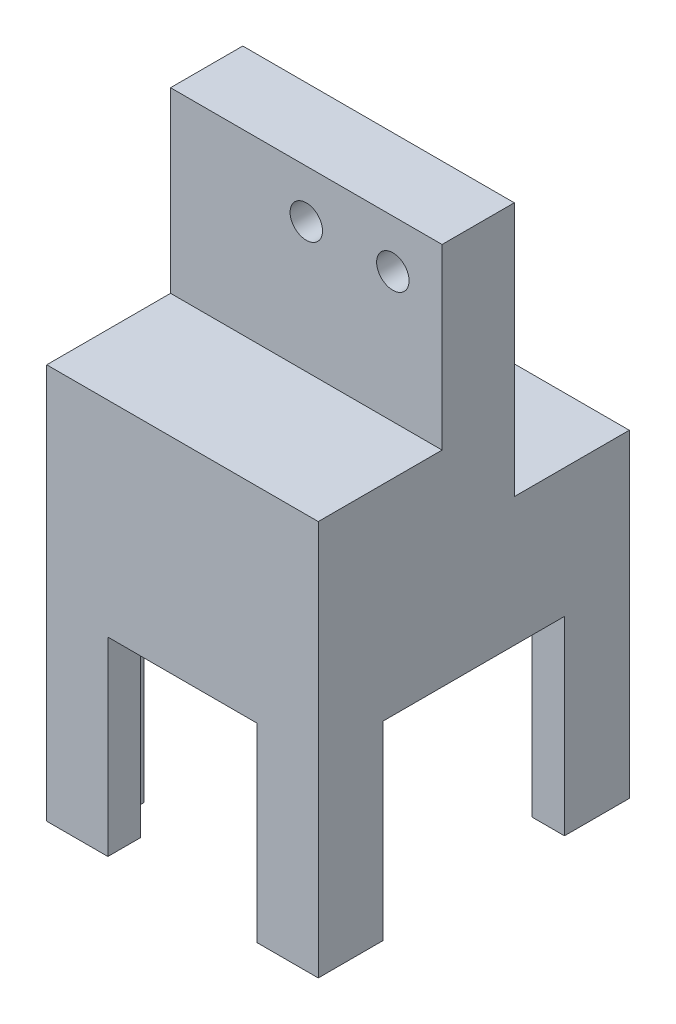
ISO-10303-21;
HEADER;
FILE_DESCRIPTION(('STEP AP214'),'2;1');
FILE_NAME('part.step','',(''),(''),'','','');
FILE_SCHEMA(('AUTOMOTIVE_DESIGN { 1 0 10303 214 1 1 1 1 }'));
ENDSEC;
DATA;
#1=APPLICATION_CONTEXT('core data for automotive mechanical design processes');
#2=APPLICATION_PROTOCOL_DEFINITION('international standard','automotive_design',2000,#1);
#3=PRODUCT_CONTEXT('',#1,'mechanical');
#4=PRODUCT('Part','Part','',(#3));
#5=PRODUCT_RELATED_PRODUCT_CATEGORY('part','',(#4));
#6=PRODUCT_DEFINITION_FORMATION('','',#4);
#7=PRODUCT_DEFINITION_CONTEXT('part definition',#1,'design');
#8=PRODUCT_DEFINITION('design','',#6,#7);
#9=PRODUCT_DEFINITION_SHAPE('','',#8);
#10=(LENGTH_UNIT() NAMED_UNIT(*) SI_UNIT(.MILLI.,.METRE.));
#11=(NAMED_UNIT(*) PLANE_ANGLE_UNIT() SI_UNIT($,.RADIAN.));
#12=(NAMED_UNIT(*) SI_UNIT($,.STERADIAN.) SOLID_ANGLE_UNIT());
#13=UNCERTAINTY_MEASURE_WITH_UNIT(LENGTH_MEASURE(1.E-05),#10,'distance_accuracy_value','');
#14=(GEOMETRIC_REPRESENTATION_CONTEXT(3) GLOBAL_UNCERTAINTY_ASSIGNED_CONTEXT((#13)) GLOBAL_UNIT_ASSIGNED_CONTEXT((#10,
#11,#12)) REPRESENTATION_CONTEXT('',''));
#15=CARTESIAN_POINT('',(0.,0.,0.));
#16=DIRECTION('',(0.,0.,1.));
#17=DIRECTION('',(1.,0.,0.));
#18=AXIS2_PLACEMENT_3D('',#15,#16,#17);
#19=CARTESIAN_POINT('',(0.,0.,0.));
#20=DIRECTION('',(0.,1.,0.));
#21=DIRECTION('',(0.,0.,1.));
#22=AXIS2_PLACEMENT_3D('',#19,#20,#21);
#23=PLANE('',#22);
#24=DIRECTION('',(-1.,0.,0.));
#25=VECTOR('',#24,1.);
#26=CARTESIAN_POINT('',(-12.55,0.,-14.375));
#27=LINE('',#26,#25);
#28=CARTESIAN_POINT('',(-6.89916134176453,0.,-14.375));
#29=VERTEX_POINT('',#28);
#30=CARTESIAN_POINT('',(-12.55,0.,-14.375));
#31=VERTEX_POINT('',#30);
#32=EDGE_CURVE('E540',#29,#31,#27,.T.);
#33=ORIENTED_EDGE('',*,*,#32,.F.);
#34=DIRECTION('',(0.,0.,1.));
#35=VECTOR('',#34,1.);
#36=CARTESIAN_POINT('',(-6.89916134176453,0.,0.));
#37=LINE('',#36,#35);
#38=CARTESIAN_POINT('',(-6.89916134176453,0.,-11.375));
#39=VERTEX_POINT('',#38);
#40=EDGE_CURVE('E382',#29,#39,#37,.T.);
#41=ORIENTED_EDGE('',*,*,#40,.T.);
#42=DIRECTION('',(1.,0.,0.));
#43=VECTOR('',#42,1.);
#44=CARTESIAN_POINT('',(-9.55,0.,-11.375));
#45=LINE('',#44,#43);
#46=CARTESIAN_POINT('',(-9.55,0.,-11.375));
#47=VERTEX_POINT('',#46);
#48=EDGE_CURVE('E489',#47,#39,#45,.T.);
#49=ORIENTED_EDGE('',*,*,#48,.F.);
#50=DIRECTION('',(0.,0.,-1.));
#51=VECTOR('',#50,1.);
#52=CARTESIAN_POINT('',(-9.55,0.,11.375));
#53=LINE('',#52,#51);
#54=CARTESIAN_POINT('',(-9.55,0.,-8.38477513407504));
#55=VERTEX_POINT('',#54);
#56=EDGE_CURVE('E503',#55,#47,#53,.T.);
#57=ORIENTED_EDGE('',*,*,#56,.F.);
#58=DIRECTION('',(-1.,0.,0.));
#59=VECTOR('',#58,1.);
#60=CARTESIAN_POINT('',(0.,0.,-8.38477513407504));
#61=LINE('',#60,#59);
#62=CARTESIAN_POINT('',(-12.55,0.,-8.38477513407504));
#63=VERTEX_POINT('',#62);
#64=EDGE_CURVE('E426',#55,#63,#61,.T.);
#65=ORIENTED_EDGE('',*,*,#64,.T.);
#66=DIRECTION('',(0.,0.,1.));
#67=VECTOR('',#66,1.);
#68=CARTESIAN_POINT('',(-12.55,0.,-14.375));
#69=LINE('',#68,#67);
#70=EDGE_CURVE('E546',#31,#63,#69,.T.);
#71=ORIENTED_EDGE('',*,*,#70,.F.);
#72=EDGE_LOOP('',(#33,#41,#49,#57,#65,#71));
#73=FACE_BOUND('',#72,.T.);
#74=ADVANCED_FACE('F44',(#73),#23,.F.);
#75=DIRECTION('',(-1.,0.,0.));
#76=VECTOR('',#75,1.);
#77=CARTESIAN_POINT('',(-9.55,0.,11.375));
#78=LINE('',#77,#76);
#79=CARTESIAN_POINT('',(-6.89916134176453,0.,11.375));
#80=VERTEX_POINT('',#79);
#81=CARTESIAN_POINT('',(-9.55,0.,11.375));
#82=VERTEX_POINT('',#81);
#83=EDGE_CURVE('E498',#80,#82,#78,.T.);
#84=ORIENTED_EDGE('',*,*,#83,.F.);
#85=DIRECTION('',(0.,0.,1.));
#86=VECTOR('',#85,1.);
#87=CARTESIAN_POINT('',(-6.89916134176453,0.,0.));
#88=LINE('',#87,#86);
#89=CARTESIAN_POINT('',(-6.89916134176453,0.,14.375));
#90=VERTEX_POINT('',#89);
#91=EDGE_CURVE('E370',#80,#90,#88,.T.);
#92=ORIENTED_EDGE('',*,*,#91,.T.);
#93=DIRECTION('',(1.,0.,0.));
#94=VECTOR('',#93,1.);
#95=CARTESIAN_POINT('',(-12.55,0.,14.375));
#96=LINE('',#95,#94);
#97=CARTESIAN_POINT('',(-12.55,0.,14.375));
#98=VERTEX_POINT('',#97);
#99=EDGE_CURVE('E531',#98,#90,#96,.T.);
#100=ORIENTED_EDGE('',*,*,#99,.F.);
#101=CARTESIAN_POINT('',(-12.55,0.,8.38477513407504));
#102=VERTEX_POINT('',#101);
#103=EDGE_CURVE('E545',#102,#98,#69,.T.);
#104=ORIENTED_EDGE('',*,*,#103,.F.);
#105=DIRECTION('',(1.,0.,0.));
#106=VECTOR('',#105,1.);
#107=CARTESIAN_POINT('',(0.,0.,8.38477513407504));
#108=LINE('',#107,#106);
#109=CARTESIAN_POINT('',(-9.55,0.,8.38477513407504));
#110=VERTEX_POINT('',#109);
#111=EDGE_CURVE('E413',#102,#110,#108,.T.);
#112=ORIENTED_EDGE('',*,*,#111,.T.);
#113=EDGE_CURVE('E504',#82,#110,#53,.T.);
#114=ORIENTED_EDGE('',*,*,#113,.F.);
#115=EDGE_LOOP('',(#84,#92,#100,#104,#112,#114));
#116=FACE_BOUND('',#115,.T.);
#117=ADVANCED_FACE('F650',(#116),#23,.F.);
#118=CARTESIAN_POINT('',(-9.55,21.67,-11.375));
#119=DIRECTION('',(0.,0.,-1.));
#120=DIRECTION('',(-1.,0.,0.));
#121=AXIS2_PLACEMENT_3D('',#118,#119,#120);
#122=PLANE('',#121);
#123=ORIENTED_EDGE('',*,*,#48,.T.);
#124=DIRECTION('',(0.,1.,0.));
#125=VECTOR('',#124,1.);
#126=CARTESIAN_POINT('',(-6.89916134176453,21.67,-11.375));
#127=LINE('',#126,#125);
#128=CARTESIAN_POINT('',(-6.89916134176453,17.57,-11.375));
#129=VERTEX_POINT('',#128);
#130=EDGE_CURVE('E378',#39,#129,#127,.T.);
#131=ORIENTED_EDGE('',*,*,#130,.T.);
#132=DIRECTION('',(1.,0.,0.));
#133=VECTOR('',#132,1.);
#134=CARTESIAN_POINT('',(-9.55,17.57,-11.375));
#135=LINE('',#134,#133);
#136=CARTESIAN_POINT('',(-9.55,17.57,-11.375));
#137=VERTEX_POINT('',#136);
#138=EDGE_CURVE('E579',#129,#137,#135,.F.);
#139=ORIENTED_EDGE('',*,*,#138,.T.);
#140=DIRECTION('',(0.,-1.,0.));
#141=VECTOR('',#140,1.);
#142=CARTESIAN_POINT('',(-9.55,21.67,-11.375));
#143=LINE('',#142,#141);
#144=EDGE_CURVE('E517',#137,#47,#143,.T.);
#145=ORIENTED_EDGE('',*,*,#144,.T.);
#146=EDGE_LOOP('',(#123,#131,#139,#145));
#147=FACE_BOUND('',#146,.T.);
#148=ADVANCED_FACE('F682',(#147),#122,.F.);
#149=CARTESIAN_POINT('',(-9.55,21.67,11.375));
#150=DIRECTION('',(0.,0.,1.));
#151=DIRECTION('',(1.,0.,0.));
#152=AXIS2_PLACEMENT_3D('',#149,#150,#151);
#153=PLANE('',#152);
#154=DIRECTION('',(-1.,0.,0.));
#155=VECTOR('',#154,1.);
#156=CARTESIAN_POINT('',(-9.55,17.57,11.375));
#157=LINE('',#156,#155);
#158=CARTESIAN_POINT('',(-9.55,17.57,11.375));
#159=VERTEX_POINT('',#158);
#160=CARTESIAN_POINT('',(-6.89916134176453,17.57,11.375));
#161=VERTEX_POINT('',#160);
#162=EDGE_CURVE('E591',#159,#161,#157,.F.);
#163=ORIENTED_EDGE('',*,*,#162,.T.);
#164=DIRECTION('',(0.,-1.,0.));
#165=VECTOR('',#164,1.);
#166=CARTESIAN_POINT('',(-6.89916134176453,21.67,11.375));
#167=LINE('',#166,#165);
#168=EDGE_CURVE('E366',#161,#80,#167,.T.);
#169=ORIENTED_EDGE('',*,*,#168,.T.);
#170=ORIENTED_EDGE('',*,*,#83,.T.);
#171=DIRECTION('',(0.,-1.,0.));
#172=VECTOR('',#171,1.);
#173=CARTESIAN_POINT('',(-9.55,21.67,11.375));
#174=LINE('',#173,#172);
#175=EDGE_CURVE('E521',#159,#82,#174,.T.);
#176=ORIENTED_EDGE('',*,*,#175,.F.);
#177=EDGE_LOOP('',(#163,#169,#170,#176));
#178=FACE_BOUND('',#177,.T.);
#179=ADVANCED_FACE('F646',(#178),#153,.F.);
#180=CARTESIAN_POINT('',(6.89916134176454,0.,-11.375));
#181=VERTEX_POINT('',#180);
#182=CARTESIAN_POINT('',(9.55,0.,-11.375));
#183=VERTEX_POINT('',#182);
#184=EDGE_CURVE('E508',#181,#183,#45,.T.);
#185=ORIENTED_EDGE('',*,*,#184,.F.);
#186=DIRECTION('',(0.,0.,-1.));
#187=VECTOR('',#186,1.);
#188=CARTESIAN_POINT('',(6.89916134176454,0.,0.));
#189=LINE('',#188,#187);
#190=CARTESIAN_POINT('',(6.89916134176454,0.,-14.375));
#191=VERTEX_POINT('',#190);
#192=EDGE_CURVE('E362',#181,#191,#189,.T.);
#193=ORIENTED_EDGE('',*,*,#192,.T.);
#194=CARTESIAN_POINT('',(12.55,0.,-14.375));
#195=VERTEX_POINT('',#194);
#196=EDGE_CURVE('E541',#195,#191,#27,.T.);
#197=ORIENTED_EDGE('',*,*,#196,.F.);
#198=DIRECTION('',(0.,0.,-1.));
#199=VECTOR('',#198,1.);
#200=CARTESIAN_POINT('',(12.55,0.,-14.375));
#201=LINE('',#200,#199);
#202=CARTESIAN_POINT('',(12.55,0.,-8.38477513407505));
#203=VERTEX_POINT('',#202);
#204=EDGE_CURVE('E516',#203,#195,#201,.T.);
#205=ORIENTED_EDGE('',*,*,#204,.F.);
#206=CARTESIAN_POINT('',(9.55,0.,-8.38477513407505));
#207=VERTEX_POINT('',#206);
#208=EDGE_CURVE('E431',#203,#207,#61,.T.);
#209=ORIENTED_EDGE('',*,*,#208,.T.);
#210=DIRECTION('',(0.,0.,1.));
#211=VECTOR('',#210,1.);
#212=CARTESIAN_POINT('',(9.55,0.,11.375));
#213=LINE('',#212,#211);
#214=EDGE_CURVE('E494',#183,#207,#213,.T.);
#215=ORIENTED_EDGE('',*,*,#214,.F.);
#216=EDGE_LOOP('',(#185,#193,#197,#205,#209,#215));
#217=FACE_BOUND('',#216,.T.);
#218=ADVANCED_FACE('F683',(#217),#23,.F.);
#219=CARTESIAN_POINT('',(12.55,53.,-14.375));
#220=DIRECTION('',(-1.,0.,0.));
#221=DIRECTION('',(0.,0.,1.));
#222=AXIS2_PLACEMENT_3D('',#219,#220,#221);
#223=PLANE('',#222);
#224=DIRECTION('',(0.,0.,-1.));
#225=VECTOR('',#224,1.);
#226=CARTESIAN_POINT('',(12.55,53.,-14.375));
#227=LINE('',#226,#225);
#228=CARTESIAN_POINT('',(12.55,53.,2.9301612));
#229=VERTEX_POINT('',#228);
#230=CARTESIAN_POINT('',(12.55,53.,-3.74571229406934));
#231=VERTEX_POINT('',#230);
#232=EDGE_CURVE('E291',#229,#231,#227,.T.);
#233=ORIENTED_EDGE('',*,*,#232,.F.);
#234=DIRECTION('',(0.,1.,0.));
#235=VECTOR('',#234,1.);
#236=CARTESIAN_POINT('',(12.55,36.54,2.9301612));
#237=LINE('',#236,#235);
#238=CARTESIAN_POINT('',(12.55,36.54,2.9301612));
#239=VERTEX_POINT('',#238);
#240=EDGE_CURVE('E281',#239,#229,#237,.T.);
#241=ORIENTED_EDGE('',*,*,#240,.F.);
#242=DIRECTION('',(0.,0.,1.));
#243=VECTOR('',#242,1.);
#244=CARTESIAN_POINT('',(12.55,36.54,-14.375));
#245=LINE('',#244,#243);
#246=CARTESIAN_POINT('',(12.55,36.54,14.375));
#247=VERTEX_POINT('',#246);
#248=EDGE_CURVE('E266',#239,#247,#245,.T.);
#249=ORIENTED_EDGE('',*,*,#248,.T.);
#250=DIRECTION('',(0.,-1.,0.));
#251=VECTOR('',#250,1.);
#252=CARTESIAN_POINT('',(12.55,53.,14.375));
#253=LINE('',#252,#251);
#254=CARTESIAN_POINT('',(12.55,0.,14.375));
#255=VERTEX_POINT('',#254);
#256=EDGE_CURVE('E535',#247,#255,#253,.T.);
#257=ORIENTED_EDGE('',*,*,#256,.T.);
#258=CARTESIAN_POINT('',(12.55,0.,8.38477513407503));
#259=VERTEX_POINT('',#258);
#260=EDGE_CURVE('E536',#255,#259,#201,.T.);
#261=ORIENTED_EDGE('',*,*,#260,.T.);
#262=DIRECTION('',(0.,-1.,0.));
#263=VECTOR('',#262,1.);
#264=CARTESIAN_POINT('',(12.55,-17.57,8.38477513407503));
#265=LINE('',#264,#263);
#266=CARTESIAN_POINT('',(12.55,17.57,8.38477513407503));
#267=VERTEX_POINT('',#266);
#268=EDGE_CURVE('E393',#267,#259,#265,.T.);
#269=ORIENTED_EDGE('',*,*,#268,.F.);
#270=DIRECTION('',(0.,0.,1.));
#271=VECTOR('',#270,1.);
#272=CARTESIAN_POINT('',(12.55,17.57,8.38477513407503));
#273=LINE('',#272,#271);
#274=CARTESIAN_POINT('',(12.55,17.57,-8.38477513407505));
#275=VERTEX_POINT('',#274);
#276=EDGE_CURVE('E389',#275,#267,#273,.T.);
#277=ORIENTED_EDGE('',*,*,#276,.F.);
#278=DIRECTION('',(0.,1.,0.));
#279=VECTOR('',#278,1.);
#280=CARTESIAN_POINT('',(12.55,-17.57,-8.38477513407505));
#281=LINE('',#280,#279);
#282=EDGE_CURVE('E386',#203,#275,#281,.T.);
#283=ORIENTED_EDGE('',*,*,#282,.F.);
#284=ORIENTED_EDGE('',*,*,#204,.T.);
#285=DIRECTION('',(0.,-1.,0.));
#286=VECTOR('',#285,1.);
#287=CARTESIAN_POINT('',(12.55,53.,-14.375));
#288=LINE('',#287,#286);
#289=CARTESIAN_POINT('',(12.55,29.4765035193945,-14.375));
#290=VERTEX_POINT('',#289);
#291=EDGE_CURVE('E562',#290,#195,#288,.T.);
#292=ORIENTED_EDGE('',*,*,#291,.F.);
#293=DIRECTION('',(0.,0.,1.));
#294=VECTOR('',#293,1.);
#295=CARTESIAN_POINT('',(12.55,29.4765035193945,-14.375));
#296=LINE('',#295,#294);
#297=CARTESIAN_POINT('',(12.55,29.4765035193945,-3.74571229406934));
#298=VERTEX_POINT('',#297);
#299=EDGE_CURVE('E313',#290,#298,#296,.T.);
#300=ORIENTED_EDGE('',*,*,#299,.T.);
#301=DIRECTION('',(0.,1.,0.));
#302=VECTOR('',#301,1.);
#303=CARTESIAN_POINT('',(12.55,53.,-3.74571229406934));
#304=LINE('',#303,#302);
#305=EDGE_CURVE('E308',#298,#231,#304,.T.);
#306=ORIENTED_EDGE('',*,*,#305,.T.);
#307=EDGE_LOOP('',(#233,#241,#249,#257,#261,#269,#277,#283,#284,#292,#300,#306));
#308=FACE_BOUND('',#307,.T.);
#309=ADVANCED_FACE('F289',(#308),#223,.F.);
#310=CARTESIAN_POINT('',(-12.55,53.,-14.375));
#311=DIRECTION('',(0.,0.,1.));
#312=DIRECTION('',(1.,0.,0.));
#313=AXIS2_PLACEMENT_3D('',#310,#311,#312);
#314=PLANE('',#313);
#315=DIRECTION('',(0.,-1.,0.));
#316=VECTOR('',#315,1.);
#317=CARTESIAN_POINT('',(-12.55,53.,-14.375));
#318=LINE('',#317,#316);
#319=CARTESIAN_POINT('',(-12.55,29.4765035193945,-14.375));
#320=VERTEX_POINT('',#319);
#321=EDGE_CURVE('E559',#320,#31,#318,.T.);
#322=ORIENTED_EDGE('',*,*,#321,.F.);
#323=DIRECTION('',(-1.,0.,0.));
#324=VECTOR('',#323,1.);
#325=CARTESIAN_POINT('',(27.45,29.4765035193945,-14.375));
#326=LINE('',#325,#324);
#327=EDGE_CURVE('E304',#290,#320,#326,.T.);
#328=ORIENTED_EDGE('',*,*,#327,.F.);
#329=ORIENTED_EDGE('',*,*,#291,.T.);
#330=ORIENTED_EDGE('',*,*,#196,.T.);
#331=DIRECTION('',(0.,-1.,0.));
#332=VECTOR('',#331,1.);
#333=CARTESIAN_POINT('',(6.89916134176454,-17.57,-14.375));
#334=LINE('',#333,#332);
#335=CARTESIAN_POINT('',(6.89916134176454,17.57,-14.375));
#336=VERTEX_POINT('',#335);
#337=EDGE_CURVE('E327',#336,#191,#334,.T.);
#338=ORIENTED_EDGE('',*,*,#337,.F.);
#339=DIRECTION('',(1.,0.,0.));
#340=VECTOR('',#339,1.);
#341=CARTESIAN_POINT('',(6.89916134176454,17.57,-14.375));
#342=LINE('',#341,#340);
#343=CARTESIAN_POINT('',(-6.89916134176453,17.57,-14.375));
#344=VERTEX_POINT('',#343);
#345=EDGE_CURVE('E324',#344,#336,#342,.T.);
#346=ORIENTED_EDGE('',*,*,#345,.F.);
#347=DIRECTION('',(0.,1.,0.));
#348=VECTOR('',#347,1.);
#349=CARTESIAN_POINT('',(-6.89916134176453,-17.57,-14.375));
#350=LINE('',#349,#348);
#351=EDGE_CURVE('E276',#29,#344,#350,.T.);
#352=ORIENTED_EDGE('',*,*,#351,.F.);
#353=ORIENTED_EDGE('',*,*,#32,.T.);
#354=EDGE_LOOP('',(#322,#328,#329,#330,#338,#346,#352,#353));
#355=FACE_BOUND('',#354,.T.);
#356=ADVANCED_FACE('F707',(#355),#314,.F.);
#357=CARTESIAN_POINT('',(-12.55,53.,-14.375));
#358=DIRECTION('',(1.,0.,0.));
#359=DIRECTION('',(0.,0.,-1.));
#360=AXIS2_PLACEMENT_3D('',#357,#358,#359);
#361=PLANE('',#360);
#362=DIRECTION('',(0.,0.,1.));
#363=VECTOR('',#362,1.);
#364=CARTESIAN_POINT('',(-12.55,36.54,5.875));
#365=LINE('',#364,#363);
#366=CARTESIAN_POINT('',(-12.55,36.54,2.9301612));
#367=VERTEX_POINT('',#366);
#368=CARTESIAN_POINT('',(-12.55,36.54,14.375));
#369=VERTEX_POINT('',#368);
#370=EDGE_CURVE('E317',#367,#369,#365,.T.);
#371=ORIENTED_EDGE('',*,*,#370,.F.);
#372=DIRECTION('',(0.,1.,0.));
#373=VECTOR('',#372,1.);
#374=CARTESIAN_POINT('',(-12.55,36.54,2.9301612));
#375=LINE('',#374,#373);
#376=CARTESIAN_POINT('',(-12.55,53.,2.9301612));
#377=VERTEX_POINT('',#376);
#378=EDGE_CURVE('E284',#367,#377,#375,.T.);
#379=ORIENTED_EDGE('',*,*,#378,.T.);
#380=DIRECTION('',(0.,0.,1.));
#381=VECTOR('',#380,1.);
#382=CARTESIAN_POINT('',(-12.55,53.,-14.375));
#383=LINE('',#382,#381);
#384=CARTESIAN_POINT('',(-12.55,53.,-3.74571229406933));
#385=VERTEX_POINT('',#384);
#386=EDGE_CURVE('E530',#385,#377,#383,.T.);
#387=ORIENTED_EDGE('',*,*,#386,.F.);
#388=DIRECTION('',(0.,1.,0.));
#389=VECTOR('',#388,1.);
#390=CARTESIAN_POINT('',(-12.55,53.,-3.74571229406933));
#391=LINE('',#390,#389);
#392=CARTESIAN_POINT('',(-12.55,29.4765035193945,-3.74571229406933));
#393=VERTEX_POINT('',#392);
#394=EDGE_CURVE('E59',#393,#385,#391,.T.);
#395=ORIENTED_EDGE('',*,*,#394,.F.);
#396=DIRECTION('',(0.,0.,1.));
#397=VECTOR('',#396,1.);
#398=CARTESIAN_POINT('',(-12.55,29.4765035193945,-14.375));
#399=LINE('',#398,#397);
#400=EDGE_CURVE('E295',#320,#393,#399,.T.);
#401=ORIENTED_EDGE('',*,*,#400,.F.);
#402=ORIENTED_EDGE('',*,*,#321,.T.);
#403=ORIENTED_EDGE('',*,*,#70,.T.);
#404=DIRECTION('',(0.,1.,0.));
#405=VECTOR('',#404,1.);
#406=CARTESIAN_POINT('',(-12.55,53.,-8.38477513407504));
#407=LINE('',#406,#405);
#408=CARTESIAN_POINT('',(-12.55,17.57,-8.38477513407504));
#409=VERTEX_POINT('',#408);
#410=EDGE_CURVE('E430',#63,#409,#407,.T.);
#411=ORIENTED_EDGE('',*,*,#410,.T.);
#412=DIRECTION('',(0.,0.,1.));
#413=VECTOR('',#412,1.);
#414=CARTESIAN_POINT('',(-12.55,17.57,-14.375));
#415=LINE('',#414,#413);
#416=CARTESIAN_POINT('',(-12.55,17.57,8.38477513407504));
#417=VERTEX_POINT('',#416);
#418=EDGE_CURVE('E409',#409,#417,#415,.T.);
#419=ORIENTED_EDGE('',*,*,#418,.T.);
#420=DIRECTION('',(0.,-1.,0.));
#421=VECTOR('',#420,1.);
#422=CARTESIAN_POINT('',(-12.55,53.,8.38477513407504));
#423=LINE('',#422,#421);
#424=EDGE_CURVE('E417',#417,#102,#423,.T.);
#425=ORIENTED_EDGE('',*,*,#424,.T.);
#426=ORIENTED_EDGE('',*,*,#103,.T.);
#427=DIRECTION('',(0.,-1.,0.));
#428=VECTOR('',#427,1.);
#429=CARTESIAN_POINT('',(-12.55,53.,14.375));
#430=LINE('',#429,#428);
#431=EDGE_CURVE('E556',#369,#98,#430,.T.);
#432=ORIENTED_EDGE('',*,*,#431,.F.);
#433=EDGE_LOOP('',(#371,#379,#387,#395,#401,#402,#403,#411,#419,#425,#426,#432));
#434=FACE_BOUND('',#433,.T.);
#435=ADVANCED_FACE('F658',(#434),#361,.F.);
#436=CARTESIAN_POINT('',(-12.55,53.,14.375));
#437=DIRECTION('',(0.,0.,-1.));
#438=DIRECTION('',(-1.,0.,0.));
#439=AXIS2_PLACEMENT_3D('',#436,#437,#438);
#440=PLANE('',#439);
#441=ORIENTED_EDGE('',*,*,#256,.F.);
#442=DIRECTION('',(-1.,0.,0.));
#443=VECTOR('',#442,1.);
#444=CARTESIAN_POINT('',(27.45,36.54,14.375));
#445=LINE('',#444,#443);
#446=EDGE_CURVE('E271',#247,#369,#445,.T.);
#447=ORIENTED_EDGE('',*,*,#446,.T.);
#448=ORIENTED_EDGE('',*,*,#431,.T.);
#449=ORIENTED_EDGE('',*,*,#99,.T.);
#450=DIRECTION('',(0.,1.,0.));
#451=VECTOR('',#450,1.);
#452=CARTESIAN_POINT('',(-6.89916134176453,53.,14.375));
#453=LINE('',#452,#451);
#454=CARTESIAN_POINT('',(-6.89916134176453,17.57,14.375));
#455=VERTEX_POINT('',#454);
#456=EDGE_CURVE('E374',#90,#455,#453,.T.);
#457=ORIENTED_EDGE('',*,*,#456,.T.);
#458=DIRECTION('',(1.,0.,0.));
#459=VECTOR('',#458,1.);
#460=CARTESIAN_POINT('',(-12.55,17.57,14.375));
#461=LINE('',#460,#459);
#462=CARTESIAN_POINT('',(6.89916134176454,17.57,14.375));
#463=VERTEX_POINT('',#462);
#464=EDGE_CURVE('E342',#455,#463,#461,.T.);
#465=ORIENTED_EDGE('',*,*,#464,.T.);
#466=DIRECTION('',(0.,-1.,0.));
#467=VECTOR('',#466,1.);
#468=CARTESIAN_POINT('',(6.89916134176453,53.,14.375));
#469=LINE('',#468,#467);
#470=CARTESIAN_POINT('',(6.89916134176454,0.,14.375));
#471=VERTEX_POINT('',#470);
#472=EDGE_CURVE('E354',#463,#471,#469,.T.);
#473=ORIENTED_EDGE('',*,*,#472,.T.);
#474=EDGE_CURVE('E550',#471,#255,#96,.T.);
#475=ORIENTED_EDGE('',*,*,#474,.T.);
#476=EDGE_LOOP('',(#441,#447,#448,#449,#457,#465,#473,#475));
#477=FACE_BOUND('',#476,.T.);
#478=ADVANCED_FACE('F699',(#477),#440,.F.);
#479=CARTESIAN_POINT('',(0.,53.,0.));
#480=DIRECTION('',(0.,1.,0.));
#481=DIRECTION('',(0.,0.,1.));
#482=AXIS2_PLACEMENT_3D('',#479,#480,#481);
#483=PLANE('',#482);
#484=DIRECTION('',(-1.,0.,0.));
#485=VECTOR('',#484,1.);
#486=CARTESIAN_POINT('',(-12.55,53.,2.9301612));
#487=LINE('',#486,#485);
#488=EDGE_CURVE('E286',#229,#377,#487,.T.);
#489=ORIENTED_EDGE('',*,*,#488,.F.);
#490=ORIENTED_EDGE('',*,*,#232,.T.);
#491=DIRECTION('',(1.,0.,0.));
#492=VECTOR('',#491,1.);
#493=CARTESIAN_POINT('',(0.,53.,-3.74571229406934));
#494=LINE('',#493,#492);
#495=EDGE_CURVE('E11',#385,#231,#494,.T.);
#496=ORIENTED_EDGE('',*,*,#495,.F.);
#497=ORIENTED_EDGE('',*,*,#386,.T.);
#498=EDGE_LOOP('',(#489,#490,#496,#497));
#499=FACE_BOUND('',#498,.T.);
#500=ADVANCED_FACE('F688',(#499),#483,.T.);
#501=ORIENTED_EDGE('',*,*,#474,.F.);
#502=DIRECTION('',(0.,0.,-1.));
#503=VECTOR('',#502,1.);
#504=CARTESIAN_POINT('',(6.89916134176454,0.,0.));
#505=LINE('',#504,#503);
#506=CARTESIAN_POINT('',(6.89916134176454,0.,11.375));
#507=VERTEX_POINT('',#506);
#508=EDGE_CURVE('E350',#471,#507,#505,.T.);
#509=ORIENTED_EDGE('',*,*,#508,.T.);
#510=CARTESIAN_POINT('',(9.55,0.,11.375));
#511=VERTEX_POINT('',#510);
#512=EDGE_CURVE('E499',#511,#507,#78,.T.);
#513=ORIENTED_EDGE('',*,*,#512,.F.);
#514=CARTESIAN_POINT('',(9.55,0.,8.38477513407504));
#515=VERTEX_POINT('',#514);
#516=EDGE_CURVE('E474',#515,#511,#213,.T.);
#517=ORIENTED_EDGE('',*,*,#516,.F.);
#518=EDGE_CURVE('E418',#515,#259,#108,.T.);
#519=ORIENTED_EDGE('',*,*,#518,.T.);
#520=ORIENTED_EDGE('',*,*,#260,.F.);
#521=EDGE_LOOP('',(#501,#509,#513,#517,#519,#520));
#522=FACE_BOUND('',#521,.T.);
#523=ADVANCED_FACE('F677',(#522),#23,.F.);
#524=CARTESIAN_POINT('',(9.55,21.67,11.375));
#525=DIRECTION('',(1.,0.,0.));
#526=DIRECTION('',(0.,0.,-1.));
#527=AXIS2_PLACEMENT_3D('',#524,#525,#526);
#528=PLANE('',#527);
#529=ORIENTED_EDGE('',*,*,#214,.T.);
#530=DIRECTION('',(0.,1.,0.));
#531=VECTOR('',#530,1.);
#532=CARTESIAN_POINT('',(9.55,21.67,-8.38477513407505));
#533=LINE('',#532,#531);
#534=CARTESIAN_POINT('',(9.55,17.57,-8.38477513407504));
#535=VERTEX_POINT('',#534);
#536=EDGE_CURVE('E435',#207,#535,#533,.T.);
#537=ORIENTED_EDGE('',*,*,#536,.T.);
#538=DIRECTION('',(0.,0.,1.));
#539=VECTOR('',#538,1.);
#540=CARTESIAN_POINT('',(9.55,17.57,11.375));
#541=LINE('',#540,#539);
#542=CARTESIAN_POINT('',(9.55,17.57,8.38477513407505));
#543=VERTEX_POINT('',#542);
#544=EDGE_CURVE('E405',#535,#543,#541,.T.);
#545=ORIENTED_EDGE('',*,*,#544,.T.);
#546=DIRECTION('',(0.,-1.,0.));
#547=VECTOR('',#546,1.);
#548=CARTESIAN_POINT('',(9.55,21.67,8.38477513407504));
#549=LINE('',#548,#547);
#550=EDGE_CURVE('E422',#543,#515,#549,.T.);
#551=ORIENTED_EDGE('',*,*,#550,.T.);
#552=ORIENTED_EDGE('',*,*,#516,.T.);
#553=DIRECTION('',(0.,-1.,0.));
#554=VECTOR('',#553,1.);
#555=CARTESIAN_POINT('',(9.55,21.67,11.375));
#556=LINE('',#555,#554);
#557=CARTESIAN_POINT('',(9.55,17.57,11.375));
#558=VERTEX_POINT('',#557);
#559=EDGE_CURVE('E493',#558,#511,#556,.T.);
#560=ORIENTED_EDGE('',*,*,#559,.F.);
#561=CARTESIAN_POINT('',(9.55,17.57,7.275));
#562=DIRECTION('',(1.,0.,0.));
#563=DIRECTION('',(0.,0.,-1.));
#564=AXIS2_PLACEMENT_3D('',#561,#562,#563);
#565=CIRCLE('',#564,4.1);
#566=CARTESIAN_POINT('',(9.55,21.67,7.275));
#567=VERTEX_POINT('',#566);
#568=EDGE_CURVE('E573',#558,#567,#565,.F.);
#569=ORIENTED_EDGE('',*,*,#568,.T.);
#570=DIRECTION('',(0.,0.,1.));
#571=VECTOR('',#570,1.);
#572=CARTESIAN_POINT('',(9.55,21.67,11.375));
#573=LINE('',#572,#571);
#574=CARTESIAN_POINT('',(9.55,21.67,-7.275));
#575=VERTEX_POINT('',#574);
#576=EDGE_CURVE('E484',#575,#567,#573,.T.);
#577=ORIENTED_EDGE('',*,*,#576,.F.);
#578=CARTESIAN_POINT('',(9.55,17.57,-7.275));
#579=DIRECTION('',(1.,0.,0.));
#580=DIRECTION('',(0.,0.,-1.));
#581=AXIS2_PLACEMENT_3D('',#578,#579,#580);
#582=CIRCLE('',#581,4.1);
#583=CARTESIAN_POINT('',(9.55,17.57,-11.375));
#584=VERTEX_POINT('',#583);
#585=EDGE_CURVE('E576',#575,#584,#582,.F.);
#586=ORIENTED_EDGE('',*,*,#585,.T.);
#587=DIRECTION('',(0.,-1.,0.));
#588=VECTOR('',#587,1.);
#589=CARTESIAN_POINT('',(9.55,21.67,-11.375));
#590=LINE('',#589,#588);
#591=EDGE_CURVE('E512',#584,#183,#590,.T.);
#592=ORIENTED_EDGE('',*,*,#591,.T.);
#593=EDGE_LOOP('',(#529,#537,#545,#551,#552,#560,#569,#577,#586,#592));
#594=FACE_BOUND('',#593,.T.);
#595=ADVANCED_FACE('F687',(#594),#528,.F.);
#596=CARTESIAN_POINT('',(6.89916134176454,17.57,-11.375));
#597=VERTEX_POINT('',#596);
#598=EDGE_CURVE('E580',#584,#597,#135,.F.);
#599=ORIENTED_EDGE('',*,*,#598,.T.);
#600=DIRECTION('',(0.,-1.,0.));
#601=VECTOR('',#600,1.);
#602=CARTESIAN_POINT('',(6.89916134176454,21.67,-11.375));
#603=LINE('',#602,#601);
#604=EDGE_CURVE('E358',#597,#181,#603,.T.);
#605=ORIENTED_EDGE('',*,*,#604,.T.);
#606=ORIENTED_EDGE('',*,*,#184,.T.);
#607=ORIENTED_EDGE('',*,*,#591,.F.);
#608=EDGE_LOOP('',(#599,#605,#606,#607));
#609=FACE_BOUND('',#608,.T.);
#610=ADVANCED_FACE('F695',(#609),#122,.F.);
#611=CARTESIAN_POINT('',(-9.55,21.67,11.375));
#612=DIRECTION('',(-1.,0.,0.));
#613=DIRECTION('',(0.,0.,1.));
#614=AXIS2_PLACEMENT_3D('',#611,#612,#613);
#615=PLANE('',#614);
#616=DIRECTION('',(0.,0.,-1.));
#617=VECTOR('',#616,1.);
#618=CARTESIAN_POINT('',(-9.55,17.57,11.375));
#619=LINE('',#618,#617);
#620=CARTESIAN_POINT('',(-9.55,17.57,8.38477513407504));
#621=VERTEX_POINT('',#620);
#622=CARTESIAN_POINT('',(-9.55,17.57,-8.38477513407504));
#623=VERTEX_POINT('',#622);
#624=EDGE_CURVE('E595',#621,#623,#619,.T.);
#625=ORIENTED_EDGE('',*,*,#624,.T.);
#626=DIRECTION('',(0.,-1.,0.));
#627=VECTOR('',#626,1.);
#628=CARTESIAN_POINT('',(-9.55,21.67,-8.38477513407504));
#629=LINE('',#628,#627);
#630=EDGE_CURVE('E53',#623,#55,#629,.T.);
#631=ORIENTED_EDGE('',*,*,#630,.T.);
#632=ORIENTED_EDGE('',*,*,#56,.T.);
#633=ORIENTED_EDGE('',*,*,#144,.F.);
#634=CARTESIAN_POINT('',(-9.55,17.57,-7.275));
#635=DIRECTION('',(-1.,0.,0.));
#636=DIRECTION('',(0.,0.,1.));
#637=AXIS2_PLACEMENT_3D('',#634,#635,#636);
#638=CIRCLE('',#637,4.1);
#639=CARTESIAN_POINT('',(-9.55,21.67,-7.275));
#640=VERTEX_POINT('',#639);
#641=EDGE_CURVE('E587',#137,#640,#638,.F.);
#642=ORIENTED_EDGE('',*,*,#641,.T.);
#643=DIRECTION('',(0.,0.,-1.));
#644=VECTOR('',#643,1.);
#645=CARTESIAN_POINT('',(-9.55,21.67,11.375));
#646=LINE('',#645,#644);
#647=CARTESIAN_POINT('',(-9.55,21.67,7.275));
#648=VERTEX_POINT('',#647);
#649=EDGE_CURVE('E488',#648,#640,#646,.T.);
#650=ORIENTED_EDGE('',*,*,#649,.F.);
#651=CARTESIAN_POINT('',(-9.55,17.57,7.275));
#652=DIRECTION('',(-1.,0.,0.));
#653=DIRECTION('',(0.,0.,1.));
#654=AXIS2_PLACEMENT_3D('',#651,#652,#653);
#655=CIRCLE('',#654,4.1);
#656=EDGE_CURVE('E584',#648,#159,#655,.F.);
#657=ORIENTED_EDGE('',*,*,#656,.T.);
#658=ORIENTED_EDGE('',*,*,#175,.T.);
#659=ORIENTED_EDGE('',*,*,#113,.T.);
#660=DIRECTION('',(0.,1.,0.));
#661=VECTOR('',#660,1.);
#662=CARTESIAN_POINT('',(-9.55,21.67,8.38477513407504));
#663=LINE('',#662,#661);
#664=EDGE_CURVE('E600',#110,#621,#663,.T.);
#665=ORIENTED_EDGE('',*,*,#664,.T.);
#666=EDGE_LOOP('',(#625,#631,#632,#633,#642,#650,#657,#658,#659,#665));
#667=FACE_BOUND('',#666,.T.);
#668=ADVANCED_FACE('F608',(#667),#615,.F.);
#669=ORIENTED_EDGE('',*,*,#512,.T.);
#670=DIRECTION('',(0.,1.,0.));
#671=VECTOR('',#670,1.);
#672=CARTESIAN_POINT('',(6.89916134176454,21.67,11.375));
#673=LINE('',#672,#671);
#674=CARTESIAN_POINT('',(6.89916134176454,17.57,11.375));
#675=VERTEX_POINT('',#674);
#676=EDGE_CURVE('E346',#507,#675,#673,.T.);
#677=ORIENTED_EDGE('',*,*,#676,.T.);
#678=EDGE_CURVE('E590',#675,#558,#157,.F.);
#679=ORIENTED_EDGE('',*,*,#678,.T.);
#680=ORIENTED_EDGE('',*,*,#559,.T.);
#681=EDGE_LOOP('',(#669,#677,#679,#680));
#682=FACE_BOUND('',#681,.T.);
#683=ADVANCED_FACE('F710',(#682),#153,.F.);
#684=CARTESIAN_POINT('',(0.,21.67,0.));
#685=DIRECTION('',(0.,-1.,0.));
#686=DIRECTION('',(0.,0.,-1.));
#687=AXIS2_PLACEMENT_3D('',#684,#685,#686);
#688=PLANE('',#687);
#689=DIRECTION('',(0.,0.,1.));
#690=VECTOR('',#689,1.);
#691=CARTESIAN_POINT('',(1.44,21.67,-2.55));
#692=LINE('',#691,#690);
#693=CARTESIAN_POINT('',(1.44,21.67,-2.55));
#694=VERTEX_POINT('',#693);
#695=CARTESIAN_POINT('',(1.44,21.67,2.55));
#696=VERTEX_POINT('',#695);
#697=EDGE_CURVE('E457',#694,#696,#692,.T.);
#698=ORIENTED_EDGE('',*,*,#697,.F.);
#699=DIRECTION('',(1.,0.,0.));
#700=VECTOR('',#699,1.);
#701=CARTESIAN_POINT('',(-1.44,21.67,-2.55));
#702=LINE('',#701,#700);
#703=CARTESIAN_POINT('',(-1.44,21.67,-2.55));
#704=VERTEX_POINT('',#703);
#705=EDGE_CURVE('E444',#704,#694,#702,.T.);
#706=ORIENTED_EDGE('',*,*,#705,.F.);
#707=DIRECTION('',(0.,0.,-1.));
#708=VECTOR('',#707,1.);
#709=CARTESIAN_POINT('',(-1.44,21.67,-2.55));
#710=LINE('',#709,#708);
#711=CARTESIAN_POINT('',(-1.44,21.67,2.55));
#712=VERTEX_POINT('',#711);
#713=EDGE_CURVE('E464',#712,#704,#710,.T.);
#714=ORIENTED_EDGE('',*,*,#713,.F.);
#715=DIRECTION('',(-1.,0.,0.));
#716=VECTOR('',#715,1.);
#717=CARTESIAN_POINT('',(-1.44,21.67,2.55));
#718=LINE('',#717,#716);
#719=EDGE_CURVE('E460',#696,#712,#718,.T.);
#720=ORIENTED_EDGE('',*,*,#719,.F.);
#721=EDGE_LOOP('',(#698,#706,#714,#720));
#722=FACE_BOUND('',#721,.T.);
#723=ORIENTED_EDGE('',*,*,#649,.T.);
#724=DIRECTION('',(1.,0.,0.));
#725=VECTOR('',#724,1.);
#726=CARTESIAN_POINT('',(0.,21.67,-7.275));
#727=LINE('',#726,#725);
#728=EDGE_CURVE('E569',#640,#575,#727,.T.);
#729=ORIENTED_EDGE('',*,*,#728,.T.);
#730=ORIENTED_EDGE('',*,*,#576,.T.);
#731=DIRECTION('',(-1.,0.,0.));
#732=VECTOR('',#731,1.);
#733=CARTESIAN_POINT('',(0.,21.67,7.275));
#734=LINE('',#733,#732);
#735=EDGE_CURVE('E565',#567,#648,#734,.T.);
#736=ORIENTED_EDGE('',*,*,#735,.T.);
#737=EDGE_LOOP('',(#723,#729,#730,#736));
#738=FACE_BOUND('',#737,.T.);
#739=ADVANCED_FACE('F732',(#722,#738),#688,.T.);
#740=CARTESIAN_POINT('',(0.,17.57,-7.275));
#741=DIRECTION('',(1.,0.,0.));
#742=DIRECTION('',(0.,0.,-1.));
#743=AXIS2_PLACEMENT_3D('',#740,#741,#742);
#744=CYLINDRICAL_SURFACE('',#743,4.1);
#745=ORIENTED_EDGE('',*,*,#641,.F.);
#746=ORIENTED_EDGE('',*,*,#138,.F.);
#747=DIRECTION('',(1.,0.,0.));
#748=VECTOR('',#747,1.);
#749=CARTESIAN_POINT('',(0.,17.57,-11.375));
#750=LINE('',#749,#748);
#751=EDGE_CURVE('E338',#129,#597,#750,.T.);
#752=ORIENTED_EDGE('',*,*,#751,.T.);
#753=ORIENTED_EDGE('',*,*,#598,.F.);
#754=ORIENTED_EDGE('',*,*,#585,.F.);
#755=ORIENTED_EDGE('',*,*,#728,.F.);
#756=EDGE_LOOP('',(#745,#746,#752,#753,#754,#755));
#757=FACE_BOUND('',#756,.T.);
#758=ADVANCED_FACE('F737',(#757),#744,.F.);
#759=CARTESIAN_POINT('',(0.,17.57,7.275));
#760=DIRECTION('',(-1.,0.,0.));
#761=DIRECTION('',(0.,0.,1.));
#762=AXIS2_PLACEMENT_3D('',#759,#760,#761);
#763=CYLINDRICAL_SURFACE('',#762,4.1);
#764=ORIENTED_EDGE('',*,*,#568,.F.);
#765=ORIENTED_EDGE('',*,*,#678,.F.);
#766=EDGE_CURVE('E596',#161,#675,#157,.F.);
#767=ORIENTED_EDGE('',*,*,#766,.F.);
#768=ORIENTED_EDGE('',*,*,#162,.F.);
#769=ORIENTED_EDGE('',*,*,#656,.F.);
#770=ORIENTED_EDGE('',*,*,#735,.F.);
#771=EDGE_LOOP('',(#764,#765,#767,#768,#769,#770));
#772=FACE_BOUND('',#771,.T.);
#773=ADVANCED_FACE('F46',(#772),#763,.F.);
#774=CARTESIAN_POINT('',(1.44,26.34,-2.55));
#775=DIRECTION('',(1.,0.,0.));
#776=DIRECTION('',(0.,0.,-1.));
#777=AXIS2_PLACEMENT_3D('',#774,#775,#776);
#778=PLANE('',#777);
#779=ORIENTED_EDGE('',*,*,#697,.T.);
#780=DIRECTION('',(0.,-1.,0.));
#781=VECTOR('',#780,1.);
#782=CARTESIAN_POINT('',(1.44,26.34,2.55));
#783=LINE('',#782,#781);
#784=CARTESIAN_POINT('',(1.44,26.34,2.55));
#785=VERTEX_POINT('',#784);
#786=EDGE_CURVE('E456',#785,#696,#783,.T.);
#787=ORIENTED_EDGE('',*,*,#786,.F.);
#788=DIRECTION('',(0.,0.,1.));
#789=VECTOR('',#788,1.);
#790=CARTESIAN_POINT('',(1.44,26.34,-2.55));
#791=LINE('',#790,#789);
#792=CARTESIAN_POINT('',(1.44,26.34,-2.55));
#793=VERTEX_POINT('',#792);
#794=EDGE_CURVE('E439',#793,#785,#791,.T.);
#795=ORIENTED_EDGE('',*,*,#794,.F.);
#796=DIRECTION('',(0.,-1.,0.));
#797=VECTOR('',#796,1.);
#798=CARTESIAN_POINT('',(1.44,26.34,-2.55));
#799=LINE('',#798,#797);
#800=EDGE_CURVE('E471',#793,#694,#799,.T.);
#801=ORIENTED_EDGE('',*,*,#800,.T.);
#802=EDGE_LOOP('',(#779,#787,#795,#801));
#803=FACE_BOUND('',#802,.T.);
#804=ADVANCED_FACE('F769',(#803),#778,.F.);
#805=CARTESIAN_POINT('',(-1.44,26.34,-2.55));
#806=DIRECTION('',(0.,0.,-1.));
#807=DIRECTION('',(-1.,0.,0.));
#808=AXIS2_PLACEMENT_3D('',#805,#806,#807);
#809=PLANE('',#808);
#810=ORIENTED_EDGE('',*,*,#705,.T.);
#811=ORIENTED_EDGE('',*,*,#800,.F.);
#812=DIRECTION('',(1.,0.,0.));
#813=VECTOR('',#812,1.);
#814=CARTESIAN_POINT('',(-1.44,26.34,-2.55));
#815=LINE('',#814,#813);
#816=CARTESIAN_POINT('',(-1.44,26.34,-2.55));
#817=VERTEX_POINT('',#816);
#818=EDGE_CURVE('E452',#817,#793,#815,.T.);
#819=ORIENTED_EDGE('',*,*,#818,.F.);
#820=DIRECTION('',(0.,-1.,0.));
#821=VECTOR('',#820,1.);
#822=CARTESIAN_POINT('',(-1.44,26.34,-2.55));
#823=LINE('',#822,#821);
#824=EDGE_CURVE('E475',#817,#704,#823,.T.);
#825=ORIENTED_EDGE('',*,*,#824,.T.);
#826=EDGE_LOOP('',(#810,#811,#819,#825));
#827=FACE_BOUND('',#826,.T.);
#828=ADVANCED_FACE('F771',(#827),#809,.F.);
#829=CARTESIAN_POINT('',(-1.44,26.34,-2.55));
#830=DIRECTION('',(-1.,0.,0.));
#831=DIRECTION('',(0.,0.,1.));
#832=AXIS2_PLACEMENT_3D('',#829,#830,#831);
#833=PLANE('',#832);
#834=ORIENTED_EDGE('',*,*,#713,.T.);
#835=ORIENTED_EDGE('',*,*,#824,.F.);
#836=DIRECTION('',(0.,0.,-1.));
#837=VECTOR('',#836,1.);
#838=CARTESIAN_POINT('',(-1.44,26.34,-2.55));
#839=LINE('',#838,#837);
#840=CARTESIAN_POINT('',(-1.44,26.34,2.55));
#841=VERTEX_POINT('',#840);
#842=EDGE_CURVE('E448',#841,#817,#839,.T.);
#843=ORIENTED_EDGE('',*,*,#842,.F.);
#844=DIRECTION('',(0.,-1.,0.));
#845=VECTOR('',#844,1.);
#846=CARTESIAN_POINT('',(-1.44,26.34,2.55));
#847=LINE('',#846,#845);
#848=EDGE_CURVE('E478',#841,#712,#847,.T.);
#849=ORIENTED_EDGE('',*,*,#848,.T.);
#850=EDGE_LOOP('',(#834,#835,#843,#849));
#851=FACE_BOUND('',#850,.T.);
#852=ADVANCED_FACE('F777',(#851),#833,.F.);
#853=CARTESIAN_POINT('',(-1.44,26.34,2.55));
#854=DIRECTION('',(0.,0.,1.));
#855=DIRECTION('',(1.,0.,0.));
#856=AXIS2_PLACEMENT_3D('',#853,#854,#855);
#857=PLANE('',#856);
#858=ORIENTED_EDGE('',*,*,#719,.T.);
#859=ORIENTED_EDGE('',*,*,#848,.F.);
#860=DIRECTION('',(-1.,0.,0.));
#861=VECTOR('',#860,1.);
#862=CARTESIAN_POINT('',(-1.44,26.34,2.55));
#863=LINE('',#862,#861);
#864=EDGE_CURVE('E443',#785,#841,#863,.T.);
#865=ORIENTED_EDGE('',*,*,#864,.F.);
#866=ORIENTED_EDGE('',*,*,#786,.T.);
#867=EDGE_LOOP('',(#858,#859,#865,#866));
#868=FACE_BOUND('',#867,.T.);
#869=ADVANCED_FACE('F773',(#868),#857,.F.);
#870=CARTESIAN_POINT('',(0.,26.34,0.));
#871=DIRECTION('',(0.,1.,0.));
#872=DIRECTION('',(0.,0.,1.));
#873=AXIS2_PLACEMENT_3D('',#870,#871,#872);
#874=PLANE('',#873);
#875=ORIENTED_EDGE('',*,*,#794,.T.);
#876=ORIENTED_EDGE('',*,*,#864,.T.);
#877=ORIENTED_EDGE('',*,*,#842,.T.);
#878=ORIENTED_EDGE('',*,*,#818,.T.);
#879=EDGE_LOOP('',(#875,#876,#877,#878));
#880=FACE_BOUND('',#879,.T.);
#881=ADVANCED_FACE('F776',(#880),#874,.F.);
#882=CARTESIAN_POINT('',(-27.45,17.57,8.38477513407505));
#883=DIRECTION('',(0.,1.,0.));
#884=DIRECTION('',(0.,0.,1.));
#885=AXIS2_PLACEMENT_3D('',#882,#883,#884);
#886=PLANE('',#885);
#887=DIRECTION('',(1.,0.,0.));
#888=VECTOR('',#887,1.);
#889=CARTESIAN_POINT('',(-27.45,17.57,-8.38477513407503));
#890=LINE('',#889,#888);
#891=EDGE_CURVE('E401',#409,#623,#890,.T.);
#892=ORIENTED_EDGE('',*,*,#891,.T.);
#893=ORIENTED_EDGE('',*,*,#624,.F.);
#894=DIRECTION('',(1.,0.,0.));
#895=VECTOR('',#894,1.);
#896=CARTESIAN_POINT('',(-27.45,17.57,8.38477513407505));
#897=LINE('',#896,#895);
#898=EDGE_CURVE('E400',#417,#621,#897,.T.);
#899=ORIENTED_EDGE('',*,*,#898,.F.);
#900=ORIENTED_EDGE('',*,*,#418,.F.);
#901=EDGE_LOOP('',(#892,#893,#899,#900));
#902=FACE_BOUND('',#901,.T.);
#903=ADVANCED_FACE('F661',(#902),#886,.F.);
#904=CARTESIAN_POINT('',(-27.45,-17.57,8.38477513407505));
#905=DIRECTION('',(0.,0.,1.));
#906=DIRECTION('',(1.,0.,0.));
#907=AXIS2_PLACEMENT_3D('',#904,#905,#906);
#908=PLANE('',#907);
#909=ORIENTED_EDGE('',*,*,#898,.T.);
#910=ORIENTED_EDGE('',*,*,#664,.F.);
#911=ORIENTED_EDGE('',*,*,#111,.F.);
#912=ORIENTED_EDGE('',*,*,#424,.F.);
#913=EDGE_LOOP('',(#909,#910,#911,#912));
#914=FACE_BOUND('',#913,.T.);
#915=ADVANCED_FACE('F655',(#914),#908,.F.);
#916=CARTESIAN_POINT('',(-27.45,-17.57,-8.38477513407503));
#917=DIRECTION('',(0.,0.,-1.));
#918=DIRECTION('',(-1.,0.,0.));
#919=AXIS2_PLACEMENT_3D('',#916,#917,#918);
#920=PLANE('',#919);
#921=ORIENTED_EDGE('',*,*,#64,.F.);
#922=ORIENTED_EDGE('',*,*,#630,.F.);
#923=ORIENTED_EDGE('',*,*,#891,.F.);
#924=ORIENTED_EDGE('',*,*,#410,.F.);
#925=EDGE_LOOP('',(#921,#922,#923,#924));
#926=FACE_BOUND('',#925,.T.);
#927=ADVANCED_FACE('F662',(#926),#920,.F.);
#928=ORIENTED_EDGE('',*,*,#282,.T.);
#929=EDGE_CURVE('E396',#535,#275,#890,.T.);
#930=ORIENTED_EDGE('',*,*,#929,.F.);
#931=ORIENTED_EDGE('',*,*,#536,.F.);
#932=ORIENTED_EDGE('',*,*,#208,.F.);
#933=EDGE_LOOP('',(#928,#930,#931,#932));
#934=FACE_BOUND('',#933,.T.);
#935=ADVANCED_FACE('F664',(#934),#920,.F.);
#936=ORIENTED_EDGE('',*,*,#550,.F.);
#937=EDGE_CURVE('E397',#543,#267,#897,.T.);
#938=ORIENTED_EDGE('',*,*,#937,.T.);
#939=ORIENTED_EDGE('',*,*,#268,.T.);
#940=ORIENTED_EDGE('',*,*,#518,.F.);
#941=EDGE_LOOP('',(#936,#938,#939,#940));
#942=FACE_BOUND('',#941,.T.);
#943=ADVANCED_FACE('F670',(#942),#908,.F.);
#944=ORIENTED_EDGE('',*,*,#929,.T.);
#945=ORIENTED_EDGE('',*,*,#276,.T.);
#946=ORIENTED_EDGE('',*,*,#937,.F.);
#947=ORIENTED_EDGE('',*,*,#544,.F.);
#948=EDGE_LOOP('',(#944,#945,#946,#947));
#949=FACE_BOUND('',#948,.T.);
#950=ADVANCED_FACE('F788',(#949),#886,.F.);
#951=CARTESIAN_POINT('',(6.89916134176454,17.57,25.625));
#952=DIRECTION('',(0.,1.,0.));
#953=DIRECTION('',(0.,0.,1.));
#954=AXIS2_PLACEMENT_3D('',#951,#952,#953);
#955=PLANE('',#954);
#956=DIRECTION('',(0.,0.,-1.));
#957=VECTOR('',#956,1.);
#958=CARTESIAN_POINT('',(-6.89916134176453,17.57,25.625));
#959=LINE('',#958,#957);
#960=EDGE_CURVE('E334',#455,#161,#959,.T.);
#961=ORIENTED_EDGE('',*,*,#960,.T.);
#962=ORIENTED_EDGE('',*,*,#766,.T.);
#963=DIRECTION('',(0.,0.,-1.));
#964=VECTOR('',#963,1.);
#965=CARTESIAN_POINT('',(6.89916134176454,17.57,25.625));
#966=LINE('',#965,#964);
#967=EDGE_CURVE('E333',#463,#675,#966,.T.);
#968=ORIENTED_EDGE('',*,*,#967,.F.);
#969=ORIENTED_EDGE('',*,*,#464,.F.);
#970=EDGE_LOOP('',(#961,#962,#968,#969));
#971=FACE_BOUND('',#970,.T.);
#972=ADVANCED_FACE('F633',(#971),#955,.F.);
#973=CARTESIAN_POINT('',(6.89916134176454,-17.57,25.625));
#974=DIRECTION('',(1.,0.,0.));
#975=DIRECTION('',(0.,0.,-1.));
#976=AXIS2_PLACEMENT_3D('',#973,#974,#975);
#977=PLANE('',#976);
#978=ORIENTED_EDGE('',*,*,#967,.T.);
#979=ORIENTED_EDGE('',*,*,#676,.F.);
#980=ORIENTED_EDGE('',*,*,#508,.F.);
#981=ORIENTED_EDGE('',*,*,#472,.F.);
#982=EDGE_LOOP('',(#978,#979,#980,#981));
#983=FACE_BOUND('',#982,.T.);
#984=ADVANCED_FACE('F803',(#983),#977,.F.);
#985=CARTESIAN_POINT('',(-6.89916134176453,-17.57,25.625));
#986=DIRECTION('',(-1.,0.,0.));
#987=DIRECTION('',(0.,0.,1.));
#988=AXIS2_PLACEMENT_3D('',#985,#986,#987);
#989=PLANE('',#988);
#990=ORIENTED_EDGE('',*,*,#91,.F.);
#991=ORIENTED_EDGE('',*,*,#168,.F.);
#992=ORIENTED_EDGE('',*,*,#960,.F.);
#993=ORIENTED_EDGE('',*,*,#456,.F.);
#994=EDGE_LOOP('',(#990,#991,#992,#993));
#995=FACE_BOUND('',#994,.T.);
#996=ADVANCED_FACE('F637',(#995),#989,.F.);
#997=ORIENTED_EDGE('',*,*,#351,.T.);
#998=EDGE_CURVE('E330',#129,#344,#959,.T.);
#999=ORIENTED_EDGE('',*,*,#998,.F.);
#1000=ORIENTED_EDGE('',*,*,#130,.F.);
#1001=ORIENTED_EDGE('',*,*,#40,.F.);
#1002=EDGE_LOOP('',(#997,#999,#1000,#1001));
#1003=FACE_BOUND('',#1002,.T.);
#1004=ADVANCED_FACE('F743',(#1003),#989,.F.);
#1005=ORIENTED_EDGE('',*,*,#604,.F.);
#1006=EDGE_CURVE('E67',#597,#336,#966,.T.);
#1007=ORIENTED_EDGE('',*,*,#1006,.T.);
#1008=ORIENTED_EDGE('',*,*,#337,.T.);
#1009=ORIENTED_EDGE('',*,*,#192,.F.);
#1010=EDGE_LOOP('',(#1005,#1007,#1008,#1009));
#1011=FACE_BOUND('',#1010,.T.);
#1012=ADVANCED_FACE('F827',(#1011),#977,.F.);
#1013=ORIENTED_EDGE('',*,*,#998,.T.);
#1014=ORIENTED_EDGE('',*,*,#345,.T.);
#1015=ORIENTED_EDGE('',*,*,#1006,.F.);
#1016=ORIENTED_EDGE('',*,*,#751,.F.);
#1017=EDGE_LOOP('',(#1013,#1014,#1015,#1016));
#1018=FACE_BOUND('',#1017,.T.);
#1019=ADVANCED_FACE('F740',(#1018),#955,.F.);
#1020=CARTESIAN_POINT('',(27.45,36.54,5.87499999999999));
#1021=DIRECTION('',(0.,-1.,0.));
#1022=DIRECTION('',(0.,0.,-1.));
#1023=AXIS2_PLACEMENT_3D('',#1020,#1021,#1022);
#1024=PLANE('',#1023);
#1025=ORIENTED_EDGE('',*,*,#248,.F.);
#1026=DIRECTION('',(-1.,0.,0.));
#1027=VECTOR('',#1026,1.);
#1028=CARTESIAN_POINT('',(-12.55,36.54,2.9301612));
#1029=LINE('',#1028,#1027);
#1030=EDGE_CURVE('E269',#239,#367,#1029,.T.);
#1031=ORIENTED_EDGE('',*,*,#1030,.T.);
#1032=ORIENTED_EDGE('',*,*,#370,.T.);
#1033=ORIENTED_EDGE('',*,*,#446,.F.);
#1034=EDGE_LOOP('',(#1025,#1031,#1032,#1033));
#1035=FACE_BOUND('',#1034,.T.);
#1036=ADVANCED_FACE('F268',(#1035),#1024,.F.);
#1037=CARTESIAN_POINT('',(27.45,29.4765035193945,-14.375));
#1038=DIRECTION('',(0.,-1.,0.));
#1039=DIRECTION('',(0.,0.,-1.));
#1040=AXIS2_PLACEMENT_3D('',#1037,#1038,#1039);
#1041=PLANE('',#1040);
#1042=ORIENTED_EDGE('',*,*,#327,.T.);
#1043=ORIENTED_EDGE('',*,*,#400,.T.);
#1044=DIRECTION('',(-1.,0.,0.));
#1045=VECTOR('',#1044,1.);
#1046=CARTESIAN_POINT('',(27.45,29.4765035193945,-3.74571229406934));
#1047=LINE('',#1046,#1045);
#1048=EDGE_CURVE('E305',#298,#393,#1047,.T.);
#1049=ORIENTED_EDGE('',*,*,#1048,.F.);
#1050=ORIENTED_EDGE('',*,*,#299,.F.);
#1051=EDGE_LOOP('',(#1042,#1043,#1049,#1050));
#1052=FACE_BOUND('',#1051,.T.);
#1053=ADVANCED_FACE('F821',(#1052),#1041,.F.);
#1054=CARTESIAN_POINT('',(27.45,53.,-3.74571229406934));
#1055=DIRECTION('',(0.,0.,1.));
#1056=DIRECTION('',(1.,0.,0.));
#1057=AXIS2_PLACEMENT_3D('',#1054,#1055,#1056);
#1058=PLANE('',#1057);
#1059=CARTESIAN_POINT('',(0.,48.5601390021105,-3.74571229406934));
#1060=DIRECTION('',(0.,0.,1.));
#1061=DIRECTION('',(1.,0.,0.));
#1062=AXIS2_PLACEMENT_3D('',#1059,#1060,#1061);
#1063=CIRCLE('',#1062,1.5);
#1064=CARTESIAN_POINT('',(1.5,48.5601390021105,-3.74571229406934));
#1065=VERTEX_POINT('',#1064);
#1066=EDGE_CURVE('E925',#1065,#1065,#1063,.T.);
#1067=ORIENTED_EDGE('',*,*,#1066,.T.);
#1068=EDGE_LOOP('',(#1067));
#1069=FACE_BOUND('',#1068,.T.);
#1070=CARTESIAN_POINT('',(8.,48.5601390021105,-3.74571229406934));
#1071=DIRECTION('',(0.,0.,1.));
#1072=DIRECTION('',(1.,0.,0.));
#1073=AXIS2_PLACEMENT_3D('',#1070,#1071,#1072);
#1074=CIRCLE('',#1073,1.5);
#1075=CARTESIAN_POINT('',(9.5,48.5601390021105,-3.74571229406934));
#1076=VERTEX_POINT('',#1075);
#1077=EDGE_CURVE('E927',#1076,#1076,#1074,.T.);
#1078=ORIENTED_EDGE('',*,*,#1077,.T.);
#1079=EDGE_LOOP('',(#1078));
#1080=FACE_BOUND('',#1079,.T.);
#1081=ORIENTED_EDGE('',*,*,#1048,.T.);
#1082=ORIENTED_EDGE('',*,*,#394,.T.);
#1083=ORIENTED_EDGE('',*,*,#495,.T.);
#1084=ORIENTED_EDGE('',*,*,#305,.F.);
#1085=EDGE_LOOP('',(#1081,#1082,#1083,#1084));
#1086=FACE_BOUND('',#1085,.T.);
#1087=ADVANCED_FACE('F816',(#1069,#1080,#1086),#1058,.F.);
#1088=CARTESIAN_POINT('',(-12.55,36.54,2.9301612));
#1089=DIRECTION('',(0.,0.,-1.));
#1090=DIRECTION('',(-1.,0.,0.));
#1091=AXIS2_PLACEMENT_3D('',#1088,#1089,#1090);
#1092=PLANE('',#1091);
#1093=CARTESIAN_POINT('',(0.,48.5601390021105,2.9301612));
#1094=DIRECTION('',(0.,0.,1.));
#1095=DIRECTION('',(1.,0.,0.));
#1096=AXIS2_PLACEMENT_3D('',#1093,#1094,#1095);
#1097=CIRCLE('',#1096,1.5);
#1098=CARTESIAN_POINT('',(1.5,48.5601390021105,2.9301612));
#1099=VERTEX_POINT('',#1098);
#1100=EDGE_CURVE('E922',#1099,#1099,#1097,.T.);
#1101=ORIENTED_EDGE('',*,*,#1100,.F.);
#1102=EDGE_LOOP('',(#1101));
#1103=FACE_BOUND('',#1102,.T.);
#1104=CARTESIAN_POINT('',(8.,48.5601390021105,2.9301612));
#1105=DIRECTION('',(0.,0.,1.));
#1106=DIRECTION('',(1.,0.,0.));
#1107=AXIS2_PLACEMENT_3D('',#1104,#1105,#1106);
#1108=CIRCLE('',#1107,1.5);
#1109=CARTESIAN_POINT('',(9.5,48.5601390021105,2.9301612));
#1110=VERTEX_POINT('',#1109);
#1111=EDGE_CURVE('E934',#1110,#1110,#1108,.T.);
#1112=ORIENTED_EDGE('',*,*,#1111,.F.);
#1113=EDGE_LOOP('',(#1112));
#1114=FACE_BOUND('',#1113,.T.);
#1115=ORIENTED_EDGE('',*,*,#488,.T.);
#1116=ORIENTED_EDGE('',*,*,#378,.F.);
#1117=ORIENTED_EDGE('',*,*,#1030,.F.);
#1118=ORIENTED_EDGE('',*,*,#240,.T.);
#1119=EDGE_LOOP('',(#1115,#1116,#1117,#1118));
#1120=FACE_BOUND('',#1119,.T.);
#1121=ADVANCED_FACE('F280',(#1103,#1114,#1120),#1092,.F.);
#1122=CARTESIAN_POINT('',(8.,48.5601390021105,-7.0698388));
#1123=DIRECTION('',(0.,0.,1.));
#1124=DIRECTION('',(1.,0.,0.));
#1125=AXIS2_PLACEMENT_3D('',#1122,#1123,#1124);
#1126=CYLINDRICAL_SURFACE('',#1125,1.5);
#1127=ORIENTED_EDGE('',*,*,#1111,.T.);
#1128=EDGE_LOOP('',(#1127));
#1129=FACE_BOUND('',#1128,.T.);
#1130=ORIENTED_EDGE('',*,*,#1077,.F.);
#1131=EDGE_LOOP('',(#1130));
#1132=FACE_BOUND('',#1131,.T.);
#1133=ADVANCED_FACE('F895',(#1129,#1132),#1126,.F.);
#1134=CARTESIAN_POINT('',(0.,48.5601390021105,-7.0698388));
#1135=DIRECTION('',(0.,0.,1.));
#1136=DIRECTION('',(1.,0.,0.));
#1137=AXIS2_PLACEMENT_3D('',#1134,#1135,#1136);
#1138=CYLINDRICAL_SURFACE('',#1137,1.5);
#1139=ORIENTED_EDGE('',*,*,#1100,.T.);
#1140=EDGE_LOOP('',(#1139));
#1141=FACE_BOUND('',#1140,.T.);
#1142=ORIENTED_EDGE('',*,*,#1066,.F.);
#1143=EDGE_LOOP('',(#1142));
#1144=FACE_BOUND('',#1143,.T.);
#1145=ADVANCED_FACE('F903',(#1141,#1144),#1138,.F.);
#1146=CLOSED_SHELL('',(#74,#117,#148,#179,#218,#309,#356,#435,#478,#500,#523,#595,#610,#668,
#683,#739,#758,#773,#804,#828,#852,#869,#881,#903,#915,#927,#935,#943,#950,#972,#984,#996,#1004,
#1012,#1019,#1036,#1053,#1087,#1121,#1133,#1145));
#1147=MANIFOLD_SOLID_BREP('B2',#1146);
#1148=ADVANCED_BREP_SHAPE_REPRESENTATION('',(#18,#1147),#14);
#1149=SHAPE_DEFINITION_REPRESENTATION(#9,#1148);
ENDSEC;
END-ISO-10303-21;
